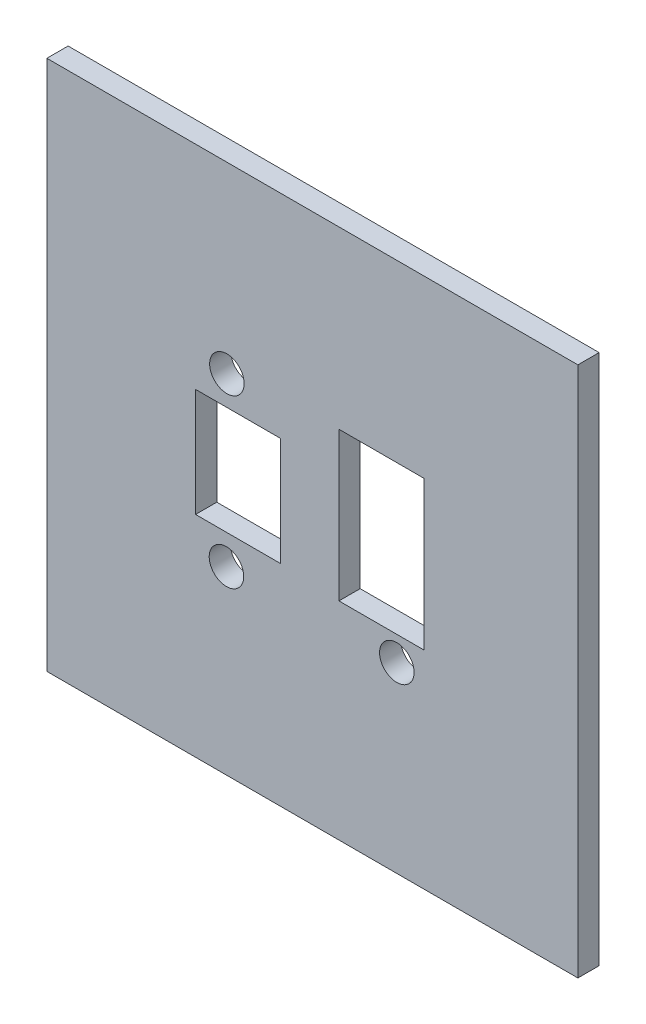
ISO-10303-21;
HEADER;
FILE_DESCRIPTION(('STEP AP214'),'2;1');
FILE_NAME('part.step','',(''),(''),'','','');
FILE_SCHEMA(('AUTOMOTIVE_DESIGN { 1 0 10303 214 1 1 1 1 }'));
ENDSEC;
DATA;
#1=APPLICATION_CONTEXT('core data for automotive mechanical design processes');
#2=APPLICATION_PROTOCOL_DEFINITION('international standard','automotive_design',2000,#1);
#3=PRODUCT_CONTEXT('',#1,'mechanical');
#4=PRODUCT('Part','Part','',(#3));
#5=PRODUCT_RELATED_PRODUCT_CATEGORY('part','',(#4));
#6=PRODUCT_DEFINITION_FORMATION('','',#4);
#7=PRODUCT_DEFINITION_CONTEXT('part definition',#1,'design');
#8=PRODUCT_DEFINITION('design','',#6,#7);
#9=PRODUCT_DEFINITION_SHAPE('','',#8);
#10=(LENGTH_UNIT() NAMED_UNIT(*) SI_UNIT(.MILLI.,.METRE.));
#11=(NAMED_UNIT(*) PLANE_ANGLE_UNIT() SI_UNIT($,.RADIAN.));
#12=(NAMED_UNIT(*) SI_UNIT($,.STERADIAN.) SOLID_ANGLE_UNIT());
#13=UNCERTAINTY_MEASURE_WITH_UNIT(LENGTH_MEASURE(1.E-05),#10,'distance_accuracy_value','');
#14=(GEOMETRIC_REPRESENTATION_CONTEXT(3) GLOBAL_UNCERTAINTY_ASSIGNED_CONTEXT((#13)) GLOBAL_UNIT_ASSIGNED_CONTEXT((#10,
#11,#12)) REPRESENTATION_CONTEXT('',''));
#15=CARTESIAN_POINT('',(0.,0.,0.));
#16=DIRECTION('',(0.,0.,1.));
#17=DIRECTION('',(1.,0.,0.));
#18=AXIS2_PLACEMENT_3D('',#15,#16,#17);
#19=CARTESIAN_POINT('',(0.,0.,2.));
#20=DIRECTION('',(1.,0.,0.));
#21=DIRECTION('',(0.,0.,-1.));
#22=AXIS2_PLACEMENT_3D('',#19,#20,#21);
#23=PLANE('',#22);
#24=DIRECTION('',(0.,-1.,0.));
#25=VECTOR('',#24,1.);
#26=CARTESIAN_POINT('',(0.,0.,0.));
#27=LINE('',#26,#25);
#28=CARTESIAN_POINT('',(0.,50.,0.));
#29=VERTEX_POINT('',#28);
#30=CARTESIAN_POINT('',(0.,0.,0.));
#31=VERTEX_POINT('',#30);
#32=EDGE_CURVE('E194',#29,#31,#27,.T.);
#33=ORIENTED_EDGE('',*,*,#32,.T.);
#34=DIRECTION('',(0.,0.,-1.));
#35=VECTOR('',#34,1.);
#36=CARTESIAN_POINT('',(0.,0.,2.));
#37=LINE('',#36,#35);
#38=CARTESIAN_POINT('',(0.,0.,2.));
#39=VERTEX_POINT('',#38);
#40=EDGE_CURVE('E11',#39,#31,#37,.T.);
#41=ORIENTED_EDGE('',*,*,#40,.F.);
#42=DIRECTION('',(0.,-1.,0.));
#43=VECTOR('',#42,1.);
#44=CARTESIAN_POINT('',(0.,0.,2.));
#45=LINE('',#44,#43);
#46=CARTESIAN_POINT('',(0.,50.,2.));
#47=VERTEX_POINT('',#46);
#48=EDGE_CURVE('E209',#47,#39,#45,.T.);
#49=ORIENTED_EDGE('',*,*,#48,.F.);
#50=DIRECTION('',(0.,0.,-1.));
#51=VECTOR('',#50,1.);
#52=CARTESIAN_POINT('',(0.,50.,2.));
#53=LINE('',#52,#51);
#54=EDGE_CURVE('E219',#47,#29,#53,.T.);
#55=ORIENTED_EDGE('',*,*,#54,.T.);
#56=EDGE_LOOP('',(#33,#41,#49,#55));
#57=FACE_BOUND('',#56,.T.);
#58=ADVANCED_FACE('F33',(#57),#23,.F.);
#59=CARTESIAN_POINT('',(0.,0.,2.));
#60=DIRECTION('',(0.,1.,0.));
#61=DIRECTION('',(0.,0.,1.));
#62=AXIS2_PLACEMENT_3D('',#59,#60,#61);
#63=PLANE('',#62);
#64=DIRECTION('',(1.,0.,0.));
#65=VECTOR('',#64,1.);
#66=CARTESIAN_POINT('',(0.,0.,0.));
#67=LINE('',#66,#65);
#68=CARTESIAN_POINT('',(50.,0.,0.));
#69=VERTEX_POINT('',#68);
#70=EDGE_CURVE('E222',#31,#69,#67,.T.);
#71=ORIENTED_EDGE('',*,*,#70,.T.);
#72=DIRECTION('',(0.,0.,-1.));
#73=VECTOR('',#72,1.);
#74=CARTESIAN_POINT('',(50.,0.,2.));
#75=LINE('',#74,#73);
#76=CARTESIAN_POINT('',(50.,0.,2.));
#77=VERTEX_POINT('',#76);
#78=EDGE_CURVE('E40',#77,#69,#75,.T.);
#79=ORIENTED_EDGE('',*,*,#78,.F.);
#80=DIRECTION('',(1.,0.,0.));
#81=VECTOR('',#80,1.);
#82=CARTESIAN_POINT('',(0.,0.,2.));
#83=LINE('',#82,#81);
#84=EDGE_CURVE('E212',#39,#77,#83,.T.);
#85=ORIENTED_EDGE('',*,*,#84,.F.);
#86=ORIENTED_EDGE('',*,*,#40,.T.);
#87=EDGE_LOOP('',(#71,#79,#85,#86));
#88=FACE_BOUND('',#87,.T.);
#89=ADVANCED_FACE('F251',(#88),#63,.F.);
#90=CARTESIAN_POINT('',(50.,0.,2.));
#91=DIRECTION('',(-1.,0.,0.));
#92=DIRECTION('',(0.,0.,1.));
#93=AXIS2_PLACEMENT_3D('',#90,#91,#92);
#94=PLANE('',#93);
#95=DIRECTION('',(0.,1.,0.));
#96=VECTOR('',#95,1.);
#97=CARTESIAN_POINT('',(50.,0.,0.));
#98=LINE('',#97,#96);
#99=CARTESIAN_POINT('',(50.,50.,0.));
#100=VERTEX_POINT('',#99);
#101=EDGE_CURVE('E224',#69,#100,#98,.T.);
#102=ORIENTED_EDGE('',*,*,#101,.T.);
#103=DIRECTION('',(0.,0.,-1.));
#104=VECTOR('',#103,1.);
#105=CARTESIAN_POINT('',(50.,50.,2.));
#106=LINE('',#105,#104);
#107=CARTESIAN_POINT('',(50.,50.,2.));
#108=VERTEX_POINT('',#107);
#109=EDGE_CURVE('E229',#108,#100,#106,.T.);
#110=ORIENTED_EDGE('',*,*,#109,.F.);
#111=DIRECTION('',(0.,1.,0.));
#112=VECTOR('',#111,1.);
#113=CARTESIAN_POINT('',(50.,0.,2.));
#114=LINE('',#113,#112);
#115=EDGE_CURVE('E215',#77,#108,#114,.T.);
#116=ORIENTED_EDGE('',*,*,#115,.F.);
#117=ORIENTED_EDGE('',*,*,#78,.T.);
#118=EDGE_LOOP('',(#102,#110,#116,#117));
#119=FACE_BOUND('',#118,.T.);
#120=ADVANCED_FACE('F236',(#119),#94,.F.);
#121=CARTESIAN_POINT('',(0.,50.,2.));
#122=DIRECTION('',(0.,-1.,0.));
#123=DIRECTION('',(0.,0.,-1.));
#124=AXIS2_PLACEMENT_3D('',#121,#122,#123);
#125=PLANE('',#124);
#126=DIRECTION('',(-1.,0.,0.));
#127=VECTOR('',#126,1.);
#128=CARTESIAN_POINT('',(0.,50.,0.));
#129=LINE('',#128,#127);
#130=EDGE_CURVE('E213',#100,#29,#129,.T.);
#131=ORIENTED_EDGE('',*,*,#130,.T.);
#132=ORIENTED_EDGE('',*,*,#54,.F.);
#133=DIRECTION('',(-1.,0.,0.));
#134=VECTOR('',#133,1.);
#135=CARTESIAN_POINT('',(0.,50.,2.));
#136=LINE('',#135,#134);
#137=EDGE_CURVE('E217',#108,#47,#136,.T.);
#138=ORIENTED_EDGE('',*,*,#137,.F.);
#139=ORIENTED_EDGE('',*,*,#109,.T.);
#140=EDGE_LOOP('',(#131,#132,#138,#139));
#141=FACE_BOUND('',#140,.T.);
#142=ADVANCED_FACE('F244',(#141),#125,.F.);
#143=CARTESIAN_POINT('',(0.,0.,2.));
#144=DIRECTION('',(0.,0.,-1.));
#145=DIRECTION('',(-1.,0.,0.));
#146=AXIS2_PLACEMENT_3D('',#143,#144,#145);
#147=PLANE('',#146);
#148=DIRECTION('',(1.,0.,0.));
#149=VECTOR('',#148,1.);
#150=CARTESIAN_POINT('',(14.,19.8,2.));
#151=LINE('',#150,#149);
#152=CARTESIAN_POINT('',(14.,19.8,2.));
#153=VERTEX_POINT('',#152);
#154=CARTESIAN_POINT('',(22.,19.8,2.));
#155=VERTEX_POINT('',#154);
#156=EDGE_CURVE('E145',#153,#155,#151,.T.);
#157=ORIENTED_EDGE('',*,*,#156,.F.);
#158=DIRECTION('',(0.,-1.,0.));
#159=VECTOR('',#158,1.);
#160=CARTESIAN_POINT('',(14.,30.,2.));
#161=LINE('',#160,#159);
#162=CARTESIAN_POINT('',(14.,30.,2.));
#163=VERTEX_POINT('',#162);
#164=EDGE_CURVE('E47',#163,#153,#161,.T.);
#165=ORIENTED_EDGE('',*,*,#164,.F.);
#166=DIRECTION('',(-1.,0.,0.));
#167=VECTOR('',#166,1.);
#168=CARTESIAN_POINT('',(14.,30.,2.));
#169=LINE('',#168,#167);
#170=CARTESIAN_POINT('',(22.,30.,2.));
#171=VERTEX_POINT('',#170);
#172=EDGE_CURVE('E138',#171,#163,#169,.T.);
#173=ORIENTED_EDGE('',*,*,#172,.F.);
#174=DIRECTION('',(0.,1.,0.));
#175=VECTOR('',#174,1.);
#176=CARTESIAN_POINT('',(22.,30.,2.));
#177=LINE('',#176,#175);
#178=EDGE_CURVE('E152',#155,#171,#177,.T.);
#179=ORIENTED_EDGE('',*,*,#178,.F.);
#180=EDGE_LOOP('',(#157,#165,#173,#179));
#181=FACE_BOUND('',#180,.T.);
#182=DIRECTION('',(1.,0.,0.));
#183=VECTOR('',#182,1.);
#184=CARTESIAN_POINT('',(27.5,19.5,2.));
#185=LINE('',#184,#183);
#186=CARTESIAN_POINT('',(27.5,19.5,2.));
#187=VERTEX_POINT('',#186);
#188=CARTESIAN_POINT('',(35.5,19.5,2.));
#189=VERTEX_POINT('',#188);
#190=EDGE_CURVE('E171',#187,#189,#185,.T.);
#191=ORIENTED_EDGE('',*,*,#190,.F.);
#192=DIRECTION('',(0.,-1.,0.));
#193=VECTOR('',#192,1.);
#194=CARTESIAN_POINT('',(27.5,33.5,2.));
#195=LINE('',#194,#193);
#196=CARTESIAN_POINT('',(27.5,33.5,2.));
#197=VERTEX_POINT('',#196);
#198=EDGE_CURVE('E55',#197,#187,#195,.T.);
#199=ORIENTED_EDGE('',*,*,#198,.F.);
#200=DIRECTION('',(-1.,0.,0.));
#201=VECTOR('',#200,1.);
#202=CARTESIAN_POINT('',(27.5,33.5,2.));
#203=LINE('',#202,#201);
#204=CARTESIAN_POINT('',(35.5,33.5,2.));
#205=VERTEX_POINT('',#204);
#206=EDGE_CURVE('E177',#205,#197,#203,.T.);
#207=ORIENTED_EDGE('',*,*,#206,.F.);
#208=DIRECTION('',(0.,1.,0.));
#209=VECTOR('',#208,1.);
#210=CARTESIAN_POINT('',(35.5,33.5,2.));
#211=LINE('',#210,#209);
#212=EDGE_CURVE('E174',#189,#205,#211,.T.);
#213=ORIENTED_EDGE('',*,*,#212,.F.);
#214=EDGE_LOOP('',(#191,#199,#207,#213));
#215=FACE_BOUND('',#214,.T.);
#216=CARTESIAN_POINT('',(16.95,32.75,2.));
#217=DIRECTION('',(0.,0.,1.));
#218=DIRECTION('',(1.,0.,0.));
#219=AXIS2_PLACEMENT_3D('',#216,#217,#218);
#220=CIRCLE('',#219,1.625);
#221=CARTESIAN_POINT('',(18.575,32.75,2.));
#222=VERTEX_POINT('',#221);
#223=EDGE_CURVE('E191',#222,#222,#220,.T.);
#224=ORIENTED_EDGE('',*,*,#223,.F.);
#225=EDGE_LOOP('',(#224));
#226=FACE_BOUND('',#225,.T.);
#227=CARTESIAN_POINT('',(16.91,17.,2.));
#228=DIRECTION('',(0.,0.,1.));
#229=DIRECTION('',(1.,0.,0.));
#230=AXIS2_PLACEMENT_3D('',#227,#228,#229);
#231=CIRCLE('',#230,1.625);
#232=CARTESIAN_POINT('',(18.535,17.,2.));
#233=VERTEX_POINT('',#232);
#234=EDGE_CURVE('E198',#233,#233,#231,.T.);
#235=ORIENTED_EDGE('',*,*,#234,.F.);
#236=EDGE_LOOP('',(#235));
#237=FACE_BOUND('',#236,.T.);
#238=CARTESIAN_POINT('',(32.95,17.2,2.));
#239=DIRECTION('',(0.,0.,1.));
#240=DIRECTION('',(1.,0.,0.));
#241=AXIS2_PLACEMENT_3D('',#238,#239,#240);
#242=CIRCLE('',#241,1.625);
#243=CARTESIAN_POINT('',(34.575,17.2,2.));
#244=VERTEX_POINT('',#243);
#245=EDGE_CURVE('E204',#244,#244,#242,.T.);
#246=ORIENTED_EDGE('',*,*,#245,.F.);
#247=EDGE_LOOP('',(#246));
#248=FACE_BOUND('',#247,.T.);
#249=ORIENTED_EDGE('',*,*,#48,.T.);
#250=ORIENTED_EDGE('',*,*,#84,.T.);
#251=ORIENTED_EDGE('',*,*,#115,.T.);
#252=ORIENTED_EDGE('',*,*,#137,.T.);
#253=EDGE_LOOP('',(#249,#250,#251,#252));
#254=FACE_BOUND('',#253,.T.);
#255=ADVANCED_FACE('F250',(#181,#215,#226,#237,#248,#254),#147,.F.);
#256=CARTESIAN_POINT('',(0.,0.,0.));
#257=DIRECTION('',(0.,0.,-1.));
#258=DIRECTION('',(-1.,0.,0.));
#259=AXIS2_PLACEMENT_3D('',#256,#257,#258);
#260=PLANE('',#259);
#261=DIRECTION('',(0.,-1.,0.));
#262=VECTOR('',#261,1.);
#263=CARTESIAN_POINT('',(14.,30.,0.));
#264=LINE('',#263,#262);
#265=CARTESIAN_POINT('',(14.,30.,0.));
#266=VERTEX_POINT('',#265);
#267=CARTESIAN_POINT('',(14.,19.8,0.));
#268=VERTEX_POINT('',#267);
#269=EDGE_CURVE('E136',#266,#268,#264,.T.);
#270=ORIENTED_EDGE('',*,*,#269,.T.);
#271=DIRECTION('',(1.,0.,0.));
#272=VECTOR('',#271,1.);
#273=CARTESIAN_POINT('',(14.,19.8,0.));
#274=LINE('',#273,#272);
#275=CARTESIAN_POINT('',(22.,19.8,0.));
#276=VERTEX_POINT('',#275);
#277=EDGE_CURVE('E122',#268,#276,#274,.T.);
#278=ORIENTED_EDGE('',*,*,#277,.T.);
#279=DIRECTION('',(0.,1.,0.));
#280=VECTOR('',#279,1.);
#281=CARTESIAN_POINT('',(22.,30.,0.));
#282=LINE('',#281,#280);
#283=CARTESIAN_POINT('',(22.,30.,0.));
#284=VERTEX_POINT('',#283);
#285=EDGE_CURVE('E147',#276,#284,#282,.T.);
#286=ORIENTED_EDGE('',*,*,#285,.T.);
#287=DIRECTION('',(-1.,0.,0.));
#288=VECTOR('',#287,1.);
#289=CARTESIAN_POINT('',(14.,30.,0.));
#290=LINE('',#289,#288);
#291=EDGE_CURVE('E143',#284,#266,#290,.T.);
#292=ORIENTED_EDGE('',*,*,#291,.T.);
#293=EDGE_LOOP('',(#270,#278,#286,#292));
#294=FACE_BOUND('',#293,.T.);
#295=DIRECTION('',(0.,-1.,0.));
#296=VECTOR('',#295,1.);
#297=CARTESIAN_POINT('',(27.5,33.5,0.));
#298=LINE('',#297,#296);
#299=CARTESIAN_POINT('',(27.5,33.5,0.));
#300=VERTEX_POINT('',#299);
#301=CARTESIAN_POINT('',(27.5,19.5,0.));
#302=VERTEX_POINT('',#301);
#303=EDGE_CURVE('E167',#300,#302,#298,.T.);
#304=ORIENTED_EDGE('',*,*,#303,.T.);
#305=DIRECTION('',(1.,0.,0.));
#306=VECTOR('',#305,1.);
#307=CARTESIAN_POINT('',(27.5,19.5,0.));
#308=LINE('',#307,#306);
#309=CARTESIAN_POINT('',(35.5,19.5,0.));
#310=VERTEX_POINT('',#309);
#311=EDGE_CURVE('E183',#302,#310,#308,.T.);
#312=ORIENTED_EDGE('',*,*,#311,.T.);
#313=DIRECTION('',(0.,1.,0.));
#314=VECTOR('',#313,1.);
#315=CARTESIAN_POINT('',(35.5,33.5,0.));
#316=LINE('',#315,#314);
#317=CARTESIAN_POINT('',(35.5,33.5,0.));
#318=VERTEX_POINT('',#317);
#319=EDGE_CURVE('E161',#310,#318,#316,.T.);
#320=ORIENTED_EDGE('',*,*,#319,.T.);
#321=DIRECTION('',(-1.,0.,0.));
#322=VECTOR('',#321,1.);
#323=CARTESIAN_POINT('',(27.5,33.5,0.));
#324=LINE('',#323,#322);
#325=EDGE_CURVE('E164',#318,#300,#324,.T.);
#326=ORIENTED_EDGE('',*,*,#325,.T.);
#327=EDGE_LOOP('',(#304,#312,#320,#326));
#328=FACE_BOUND('',#327,.T.);
#329=CARTESIAN_POINT('',(16.95,32.75,0.));
#330=DIRECTION('',(0.,0.,-1.));
#331=DIRECTION('',(-1.,0.,0.));
#332=AXIS2_PLACEMENT_3D('',#329,#330,#331);
#333=CIRCLE('',#332,1.625);
#334=CARTESIAN_POINT('',(15.325,32.75,0.));
#335=VERTEX_POINT('',#334);
#336=EDGE_CURVE('E195',#335,#335,#333,.F.);
#337=ORIENTED_EDGE('',*,*,#336,.T.);
#338=EDGE_LOOP('',(#337));
#339=FACE_BOUND('',#338,.T.);
#340=CARTESIAN_POINT('',(16.91,17.,0.));
#341=DIRECTION('',(0.,0.,-1.));
#342=DIRECTION('',(-1.,0.,0.));
#343=AXIS2_PLACEMENT_3D('',#340,#341,#342);
#344=CIRCLE('',#343,1.625);
#345=CARTESIAN_POINT('',(15.285,17.,0.));
#346=VERTEX_POINT('',#345);
#347=EDGE_CURVE('E201',#346,#346,#344,.F.);
#348=ORIENTED_EDGE('',*,*,#347,.T.);
#349=EDGE_LOOP('',(#348));
#350=FACE_BOUND('',#349,.T.);
#351=CARTESIAN_POINT('',(32.95,17.2,0.));
#352=DIRECTION('',(0.,0.,-1.));
#353=DIRECTION('',(-1.,0.,0.));
#354=AXIS2_PLACEMENT_3D('',#351,#352,#353);
#355=CIRCLE('',#354,1.625);
#356=CARTESIAN_POINT('',(31.325,17.2,0.));
#357=VERTEX_POINT('',#356);
#358=EDGE_CURVE('E132',#357,#357,#355,.F.);
#359=ORIENTED_EDGE('',*,*,#358,.T.);
#360=EDGE_LOOP('',(#359));
#361=FACE_BOUND('',#360,.T.);
#362=ORIENTED_EDGE('',*,*,#32,.F.);
#363=ORIENTED_EDGE('',*,*,#130,.F.);
#364=ORIENTED_EDGE('',*,*,#101,.F.);
#365=ORIENTED_EDGE('',*,*,#70,.F.);
#366=EDGE_LOOP('',(#362,#363,#364,#365));
#367=FACE_BOUND('',#366,.T.);
#368=ADVANCED_FACE('F141',(#294,#328,#339,#350,#361,#367),#260,.T.);
#369=CARTESIAN_POINT('',(32.95,17.2,-0.00100000000000013));
#370=DIRECTION('',(0.,0.,1.));
#371=DIRECTION('',(1.,0.,0.));
#372=AXIS2_PLACEMENT_3D('',#369,#370,#371);
#373=CYLINDRICAL_SURFACE('',#372,1.625);
#374=ORIENTED_EDGE('',*,*,#358,.F.);
#375=EDGE_LOOP('',(#374));
#376=FACE_BOUND('',#375,.T.);
#377=ORIENTED_EDGE('',*,*,#245,.T.);
#378=EDGE_LOOP('',(#377));
#379=FACE_BOUND('',#378,.T.);
#380=ADVANCED_FACE('F263',(#376,#379),#373,.F.);
#381=CARTESIAN_POINT('',(16.91,17.,-0.00100000000000013));
#382=DIRECTION('',(0.,0.,1.));
#383=DIRECTION('',(1.,0.,0.));
#384=AXIS2_PLACEMENT_3D('',#381,#382,#383);
#385=CYLINDRICAL_SURFACE('',#384,1.625);
#386=ORIENTED_EDGE('',*,*,#347,.F.);
#387=EDGE_LOOP('',(#386));
#388=FACE_BOUND('',#387,.T.);
#389=ORIENTED_EDGE('',*,*,#234,.T.);
#390=EDGE_LOOP('',(#389));
#391=FACE_BOUND('',#390,.T.);
#392=ADVANCED_FACE('F269',(#388,#391),#385,.F.);
#393=CARTESIAN_POINT('',(16.95,32.75,-0.00100000000000013));
#394=DIRECTION('',(0.,0.,1.));
#395=DIRECTION('',(1.,0.,0.));
#396=AXIS2_PLACEMENT_3D('',#393,#394,#395);
#397=CYLINDRICAL_SURFACE('',#396,1.625);
#398=ORIENTED_EDGE('',*,*,#336,.F.);
#399=EDGE_LOOP('',(#398));
#400=FACE_BOUND('',#399,.T.);
#401=ORIENTED_EDGE('',*,*,#223,.T.);
#402=EDGE_LOOP('',(#401));
#403=FACE_BOUND('',#402,.T.);
#404=ADVANCED_FACE('F273',(#400,#403),#397,.F.);
#405=CARTESIAN_POINT('',(27.5,33.5,-0.00100000000000013));
#406=DIRECTION('',(-1.,0.,0.));
#407=DIRECTION('',(0.,0.,1.));
#408=AXIS2_PLACEMENT_3D('',#405,#406,#407);
#409=PLANE('',#408);
#410=DIRECTION('',(0.,0.,1.));
#411=VECTOR('',#410,1.);
#412=CARTESIAN_POINT('',(27.5,33.5,-0.00100000000000013));
#413=LINE('',#412,#411);
#414=EDGE_CURVE('E181',#300,#197,#413,.T.);
#415=ORIENTED_EDGE('',*,*,#414,.T.);
#416=ORIENTED_EDGE('',*,*,#198,.T.);
#417=DIRECTION('',(0.,0.,1.));
#418=VECTOR('',#417,1.);
#419=CARTESIAN_POINT('',(27.5,19.5,-0.00100000000000013));
#420=LINE('',#419,#418);
#421=EDGE_CURVE('E180',#302,#187,#420,.T.);
#422=ORIENTED_EDGE('',*,*,#421,.F.);
#423=ORIENTED_EDGE('',*,*,#303,.F.);
#424=EDGE_LOOP('',(#415,#416,#422,#423));
#425=FACE_BOUND('',#424,.T.);
#426=ADVANCED_FACE('F277',(#425),#409,.F.);
#427=CARTESIAN_POINT('',(27.5,33.5,-0.00100000000000013));
#428=DIRECTION('',(0.,1.,0.));
#429=DIRECTION('',(0.,0.,1.));
#430=AXIS2_PLACEMENT_3D('',#427,#428,#429);
#431=PLANE('',#430);
#432=DIRECTION('',(0.,0.,1.));
#433=VECTOR('',#432,1.);
#434=CARTESIAN_POINT('',(35.5,33.5,-0.00100000000000013));
#435=LINE('',#434,#433);
#436=EDGE_CURVE('E184',#318,#205,#435,.T.);
#437=ORIENTED_EDGE('',*,*,#436,.T.);
#438=ORIENTED_EDGE('',*,*,#206,.T.);
#439=ORIENTED_EDGE('',*,*,#414,.F.);
#440=ORIENTED_EDGE('',*,*,#325,.F.);
#441=EDGE_LOOP('',(#437,#438,#439,#440));
#442=FACE_BOUND('',#441,.T.);
#443=ADVANCED_FACE('F281',(#442),#431,.F.);
#444=CARTESIAN_POINT('',(35.5,33.5,-0.00100000000000013));
#445=DIRECTION('',(1.,0.,0.));
#446=DIRECTION('',(0.,0.,-1.));
#447=AXIS2_PLACEMENT_3D('',#444,#445,#446);
#448=PLANE('',#447);
#449=DIRECTION('',(0.,0.,1.));
#450=VECTOR('',#449,1.);
#451=CARTESIAN_POINT('',(35.5,19.5,-0.00100000000000013));
#452=LINE('',#451,#450);
#453=EDGE_CURVE('E186',#310,#189,#452,.T.);
#454=ORIENTED_EDGE('',*,*,#453,.T.);
#455=ORIENTED_EDGE('',*,*,#212,.T.);
#456=ORIENTED_EDGE('',*,*,#436,.F.);
#457=ORIENTED_EDGE('',*,*,#319,.F.);
#458=EDGE_LOOP('',(#454,#455,#456,#457));
#459=FACE_BOUND('',#458,.T.);
#460=ADVANCED_FACE('F285',(#459),#448,.F.);
#461=CARTESIAN_POINT('',(27.5,19.5,-0.00100000000000013));
#462=DIRECTION('',(0.,-1.,0.));
#463=DIRECTION('',(1.,0.,0.));
#464=AXIS2_PLACEMENT_3D('',#461,#462,#463);
#465=PLANE('',#464);
#466=ORIENTED_EDGE('',*,*,#421,.T.);
#467=ORIENTED_EDGE('',*,*,#190,.T.);
#468=ORIENTED_EDGE('',*,*,#453,.F.);
#469=ORIENTED_EDGE('',*,*,#311,.F.);
#470=EDGE_LOOP('',(#466,#467,#468,#469));
#471=FACE_BOUND('',#470,.T.);
#472=ADVANCED_FACE('F282',(#471),#465,.F.);
#473=CARTESIAN_POINT('',(14.,30.,-0.00100000000000013));
#474=DIRECTION('',(-1.,0.,0.));
#475=DIRECTION('',(0.,0.,1.));
#476=AXIS2_PLACEMENT_3D('',#473,#474,#475);
#477=PLANE('',#476);
#478=DIRECTION('',(0.,0.,1.));
#479=VECTOR('',#478,1.);
#480=CARTESIAN_POINT('',(14.,30.,-0.00100000000000013));
#481=LINE('',#480,#479);
#482=EDGE_CURVE('E133',#266,#163,#481,.T.);
#483=ORIENTED_EDGE('',*,*,#482,.T.);
#484=ORIENTED_EDGE('',*,*,#164,.T.);
#485=DIRECTION('',(0.,0.,1.));
#486=VECTOR('',#485,1.);
#487=CARTESIAN_POINT('',(14.,19.8,-0.00100000000000013));
#488=LINE('',#487,#486);
#489=EDGE_CURVE('E125',#268,#153,#488,.T.);
#490=ORIENTED_EDGE('',*,*,#489,.F.);
#491=ORIENTED_EDGE('',*,*,#269,.F.);
#492=EDGE_LOOP('',(#483,#484,#490,#491));
#493=FACE_BOUND('',#492,.T.);
#494=ADVANCED_FACE('F135',(#493),#477,.F.);
#495=CARTESIAN_POINT('',(14.,30.,-0.00100000000000013));
#496=DIRECTION('',(0.,1.,0.));
#497=DIRECTION('',(0.,0.,1.));
#498=AXIS2_PLACEMENT_3D('',#495,#496,#497);
#499=PLANE('',#498);
#500=DIRECTION('',(0.,0.,1.));
#501=VECTOR('',#500,1.);
#502=CARTESIAN_POINT('',(22.,30.,-0.00100000000000013));
#503=LINE('',#502,#501);
#504=EDGE_CURVE('E158',#284,#171,#503,.T.);
#505=ORIENTED_EDGE('',*,*,#504,.T.);
#506=ORIENTED_EDGE('',*,*,#172,.T.);
#507=ORIENTED_EDGE('',*,*,#482,.F.);
#508=ORIENTED_EDGE('',*,*,#291,.F.);
#509=EDGE_LOOP('',(#505,#506,#507,#508));
#510=FACE_BOUND('',#509,.T.);
#511=ADVANCED_FACE('F295',(#510),#499,.F.);
#512=CARTESIAN_POINT('',(22.,30.,-0.00100000000000013));
#513=DIRECTION('',(1.,0.,0.));
#514=DIRECTION('',(0.,1.,0.));
#515=AXIS2_PLACEMENT_3D('',#512,#513,#514);
#516=PLANE('',#515);
#517=DIRECTION('',(0.,0.,1.));
#518=VECTOR('',#517,1.);
#519=CARTESIAN_POINT('',(22.,19.8,-0.00100000000000013));
#520=LINE('',#519,#518);
#521=EDGE_CURVE('E127',#276,#155,#520,.T.);
#522=ORIENTED_EDGE('',*,*,#521,.T.);
#523=ORIENTED_EDGE('',*,*,#178,.T.);
#524=ORIENTED_EDGE('',*,*,#504,.F.);
#525=ORIENTED_EDGE('',*,*,#285,.F.);
#526=EDGE_LOOP('',(#522,#523,#524,#525));
#527=FACE_BOUND('',#526,.T.);
#528=ADVANCED_FACE('F298',(#527),#516,.F.);
#529=CARTESIAN_POINT('',(14.,19.8,-0.00100000000000013));
#530=DIRECTION('',(0.,-1.,0.));
#531=DIRECTION('',(1.,0.,0.));
#532=AXIS2_PLACEMENT_3D('',#529,#530,#531);
#533=PLANE('',#532);
#534=ORIENTED_EDGE('',*,*,#489,.T.);
#535=ORIENTED_EDGE('',*,*,#156,.T.);
#536=ORIENTED_EDGE('',*,*,#521,.F.);
#537=ORIENTED_EDGE('',*,*,#277,.F.);
#538=EDGE_LOOP('',(#534,#535,#536,#537));
#539=FACE_BOUND('',#538,.T.);
#540=ADVANCED_FACE('F123',(#539),#533,.F.);
#541=CLOSED_SHELL('',(#58,#89,#120,#142,#255,#368,#380,#392,#404,#426,#443,#460,#472,#494,#511,
#528,#540));
#542=MANIFOLD_SOLID_BREP('B2',#541);
#543=ADVANCED_BREP_SHAPE_REPRESENTATION('',(#18,#542),#14);
#544=SHAPE_DEFINITION_REPRESENTATION(#9,#543);
ENDSEC;
END-ISO-10303-21;
